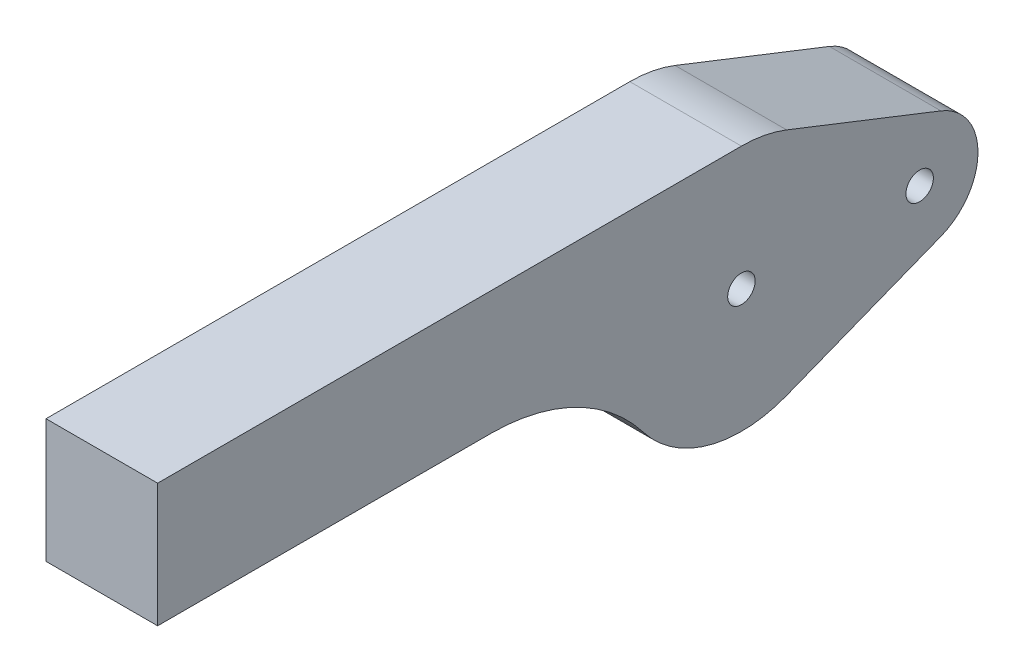
ISO-10303-21;
HEADER;
FILE_DESCRIPTION(('STEP AP214'),'2;1');
FILE_NAME('part.step','',(''),(''),'','','');
FILE_SCHEMA(('AUTOMOTIVE_DESIGN { 1 0 10303 214 1 1 1 1 }'));
ENDSEC;
DATA;
#1=APPLICATION_CONTEXT('core data for automotive mechanical design processes');
#2=APPLICATION_PROTOCOL_DEFINITION('international standard','automotive_design',2000,#1);
#3=PRODUCT_CONTEXT('',#1,'mechanical');
#4=PRODUCT('Part','Part','',(#3));
#5=PRODUCT_RELATED_PRODUCT_CATEGORY('part','',(#4));
#6=PRODUCT_DEFINITION_FORMATION('','',#4);
#7=PRODUCT_DEFINITION_CONTEXT('part definition',#1,'design');
#8=PRODUCT_DEFINITION('design','',#6,#7);
#9=PRODUCT_DEFINITION_SHAPE('','',#8);
#10=(LENGTH_UNIT() NAMED_UNIT(*) SI_UNIT(.MILLI.,.METRE.));
#11=(NAMED_UNIT(*) PLANE_ANGLE_UNIT() SI_UNIT($,.RADIAN.));
#12=(NAMED_UNIT(*) SI_UNIT($,.STERADIAN.) SOLID_ANGLE_UNIT());
#13=UNCERTAINTY_MEASURE_WITH_UNIT(LENGTH_MEASURE(1.E-05),#10,'distance_accuracy_value','');
#14=(GEOMETRIC_REPRESENTATION_CONTEXT(3) GLOBAL_UNCERTAINTY_ASSIGNED_CONTEXT((#13)) GLOBAL_UNIT_ASSIGNED_CONTEXT((#10,
#11,#12)) REPRESENTATION_CONTEXT('',''));
#15=CARTESIAN_POINT('',(0.,0.,0.));
#16=DIRECTION('',(0.,0.,1.));
#17=DIRECTION('',(1.,0.,0.));
#18=AXIS2_PLACEMENT_3D('',#15,#16,#17);
#19=CARTESIAN_POINT('',(8.13,-12.6395781143614,-4.97017753993936));
#20=DIRECTION('',(0.,-0.930635452518069,-0.365947611710323));
#21=DIRECTION('',(0.,0.365947611710323,-0.930635452518069));
#22=AXIS2_PLACEMENT_3D('',#19,#20,#21);
#23=PLANE('',#22);
#24=DIRECTION('',(0.,-0.365947611710323,0.930635452518069));
#25=VECTOR('',#24,1.);
#26=CARTESIAN_POINT('',(0.,-12.6395781143614,-4.97017753993936));
#27=LINE('',#26,#25);
#28=CARTESIAN_POINT('',(0.,-3.95520067320179,-27.0552773497689));
#29=VERTEX_POINT('',#28);
#30=CARTESIAN_POINT('',(0.,-8.37571907266262,-15.8135285053929));
#31=VERTEX_POINT('',#30);
#32=EDGE_CURVE('E125',#29,#31,#27,.T.);
#33=ORIENTED_EDGE('',*,*,#32,.F.);
#34=DIRECTION('',(-1.,0.,0.));
#35=VECTOR('',#34,1.);
#36=CARTESIAN_POINT('',(8.13,-3.95520067320179,-27.0552773497689));
#37=LINE('',#36,#35);
#38=CARTESIAN_POINT('',(8.13,-3.95520067320179,-27.0552773497689));
#39=VERTEX_POINT('',#38);
#40=EDGE_CURVE('E119',#39,#29,#37,.T.);
#41=ORIENTED_EDGE('',*,*,#40,.F.);
#42=DIRECTION('',(0.,-0.365947611710323,0.930635452518069));
#43=VECTOR('',#42,1.);
#44=CARTESIAN_POINT('',(8.13,-12.6395781143614,-4.97017753993936));
#45=LINE('',#44,#43);
#46=CARTESIAN_POINT('',(8.13,-8.37571907266262,-15.8135285053929));
#47=VERTEX_POINT('',#46);
#48=EDGE_CURVE('E123',#39,#47,#45,.T.);
#49=ORIENTED_EDGE('',*,*,#48,.T.);
#50=DIRECTION('',(-1.,0.,0.));
#51=VECTOR('',#50,1.);
#52=CARTESIAN_POINT('',(8.13,-8.37571907266262,-15.8135285053929));
#53=LINE('',#52,#51);
#54=EDGE_CURVE('E179',#47,#31,#53,.T.);
#55=ORIENTED_EDGE('',*,*,#54,.T.);
#56=EDGE_LOOP('',(#33,#41,#49,#55));
#57=FACE_BOUND('',#56,.T.);
#58=ADVANCED_FACE('F47',(#57),#23,.T.);
#59=CARTESIAN_POINT('',(8.13,0.,-25.5));
#60=DIRECTION('',(-1.,0.,0.));
#61=DIRECTION('',(0.,0.,1.));
#62=AXIS2_PLACEMENT_3D('',#59,#60,#61);
#63=CYLINDRICAL_SURFACE('',#62,4.25);
#64=CARTESIAN_POINT('',(0.,0.,-25.5));
#65=DIRECTION('',(1.,0.,0.));
#66=DIRECTION('',(0.,0.,-1.));
#67=AXIS2_PLACEMENT_3D('',#64,#65,#66);
#68=CIRCLE('',#67,4.25);
#69=CARTESIAN_POINT('',(0.,3.95520067320179,-27.0552773497689));
#70=VERTEX_POINT('',#69);
#71=EDGE_CURVE('E182',#29,#70,#68,.T.);
#72=ORIENTED_EDGE('',*,*,#71,.T.);
#73=DIRECTION('',(-1.,0.,0.));
#74=VECTOR('',#73,1.);
#75=CARTESIAN_POINT('',(8.13,3.95520067320179,-27.0552773497689));
#76=LINE('',#75,#74);
#77=CARTESIAN_POINT('',(8.13,3.95520067320179,-27.0552773497689));
#78=VERTEX_POINT('',#77);
#79=EDGE_CURVE('E130',#78,#70,#76,.T.);
#80=ORIENTED_EDGE('',*,*,#79,.F.);
#81=CARTESIAN_POINT('',(8.13,0.,-25.5));
#82=DIRECTION('',(1.,0.,0.));
#83=DIRECTION('',(0.,0.,-1.));
#84=AXIS2_PLACEMENT_3D('',#81,#82,#83);
#85=CIRCLE('',#84,4.25);
#86=EDGE_CURVE('E133',#39,#78,#85,.T.);
#87=ORIENTED_EDGE('',*,*,#86,.F.);
#88=ORIENTED_EDGE('',*,*,#40,.T.);
#89=EDGE_LOOP('',(#72,#80,#87,#88));
#90=FACE_BOUND('',#89,.T.);
#91=ADVANCED_FACE('F134',(#90),#63,.T.);
#92=CARTESIAN_POINT('',(8.13,12.6395781143614,-4.97017753993937));
#93=DIRECTION('',(0.,-0.930635452518069,0.365947611710324));
#94=DIRECTION('',(0.,-0.365947611710324,-0.930635452518069));
#95=AXIS2_PLACEMENT_3D('',#92,#93,#94);
#96=PLANE('',#95);
#97=DIRECTION('',(0.,0.365947611710324,0.930635452518069));
#98=VECTOR('',#97,1.);
#99=CARTESIAN_POINT('',(0.,12.6395781143614,-4.97017753993937));
#100=LINE('',#99,#98);
#101=CARTESIAN_POINT('',(0.,8.37571907266262,-15.8135285053929));
#102=VERTEX_POINT('',#101);
#103=EDGE_CURVE('E185',#70,#102,#100,.T.);
#104=ORIENTED_EDGE('',*,*,#103,.T.);
#105=DIRECTION('',(-1.,0.,0.));
#106=VECTOR('',#105,1.);
#107=CARTESIAN_POINT('',(8.13,8.37571907266262,-15.8135285053929));
#108=LINE('',#107,#106);
#109=CARTESIAN_POINT('',(8.13,8.37571907266262,-15.8135285053929));
#110=VERTEX_POINT('',#109);
#111=EDGE_CURVE('E220',#110,#102,#108,.T.);
#112=ORIENTED_EDGE('',*,*,#111,.F.);
#113=DIRECTION('',(0.,0.365947611710324,0.930635452518069));
#114=VECTOR('',#113,1.);
#115=CARTESIAN_POINT('',(8.13,12.6395781143614,-4.97017753993937));
#116=LINE('',#115,#114);
#117=EDGE_CURVE('E139',#78,#110,#116,.T.);
#118=ORIENTED_EDGE('',*,*,#117,.F.);
#119=ORIENTED_EDGE('',*,*,#79,.T.);
#120=EDGE_LOOP('',(#104,#112,#118,#119));
#121=FACE_BOUND('',#120,.T.);
#122=ADVANCED_FACE('F241',(#121),#96,.F.);
#123=CARTESIAN_POINT('',(8.13,0.,-12.52));
#124=DIRECTION('',(-1.,0.,0.));
#125=DIRECTION('',(0.,0.,1.));
#126=AXIS2_PLACEMENT_3D('',#123,#124,#125);
#127=CYLINDRICAL_SURFACE('',#126,9.);
#128=CARTESIAN_POINT('',(0.,0.,-12.52));
#129=DIRECTION('',(1.,0.,0.));
#130=DIRECTION('',(0.,0.,-1.));
#131=AXIS2_PLACEMENT_3D('',#128,#129,#130);
#132=CIRCLE('',#131,9.);
#133=CARTESIAN_POINT('',(0.,9.,-12.52));
#134=VERTEX_POINT('',#133);
#135=EDGE_CURVE('E188',#102,#134,#132,.T.);
#136=ORIENTED_EDGE('',*,*,#135,.T.);
#137=DIRECTION('',(-1.,0.,0.));
#138=VECTOR('',#137,1.);
#139=CARTESIAN_POINT('',(8.13,9.,-12.52));
#140=LINE('',#139,#138);
#141=CARTESIAN_POINT('',(8.13,9.,-12.52));
#142=VERTEX_POINT('',#141);
#143=EDGE_CURVE('E216',#142,#134,#140,.T.);
#144=ORIENTED_EDGE('',*,*,#143,.F.);
#145=CARTESIAN_POINT('',(8.13,0.,-12.52));
#146=DIRECTION('',(1.,0.,0.));
#147=DIRECTION('',(0.,0.,-1.));
#148=AXIS2_PLACEMENT_3D('',#145,#146,#147);
#149=CIRCLE('',#148,9.);
#150=EDGE_CURVE('E156',#110,#142,#149,.T.);
#151=ORIENTED_EDGE('',*,*,#150,.F.);
#152=ORIENTED_EDGE('',*,*,#111,.T.);
#153=EDGE_LOOP('',(#136,#144,#151,#152));
#154=FACE_BOUND('',#153,.T.);
#155=ADVANCED_FACE('F249',(#154),#127,.T.);
#156=CARTESIAN_POINT('',(8.13,9.,0.));
#157=DIRECTION('',(0.,-1.,0.));
#158=DIRECTION('',(0.,0.,-1.));
#159=AXIS2_PLACEMENT_3D('',#156,#157,#158);
#160=PLANE('',#159);
#161=DIRECTION('',(0.,0.,1.));
#162=VECTOR('',#161,1.);
#163=CARTESIAN_POINT('',(0.,9.,0.));
#164=LINE('',#163,#162);
#165=CARTESIAN_POINT('',(0.,9.,30.));
#166=VERTEX_POINT('',#165);
#167=EDGE_CURVE('E191',#134,#166,#164,.T.);
#168=ORIENTED_EDGE('',*,*,#167,.T.);
#169=DIRECTION('',(-1.,0.,0.));
#170=VECTOR('',#169,1.);
#171=CARTESIAN_POINT('',(8.13,9.,30.));
#172=LINE('',#171,#170);
#173=CARTESIAN_POINT('',(8.13,9.,30.));
#174=VERTEX_POINT('',#173);
#175=EDGE_CURVE('E213',#174,#166,#172,.T.);
#176=ORIENTED_EDGE('',*,*,#175,.F.);
#177=DIRECTION('',(0.,0.,1.));
#178=VECTOR('',#177,1.);
#179=CARTESIAN_POINT('',(8.13,9.,0.));
#180=LINE('',#179,#178);
#181=EDGE_CURVE('E159',#142,#174,#180,.T.);
#182=ORIENTED_EDGE('',*,*,#181,.F.);
#183=ORIENTED_EDGE('',*,*,#143,.T.);
#184=EDGE_LOOP('',(#168,#176,#182,#183));
#185=FACE_BOUND('',#184,.T.);
#186=ADVANCED_FACE('F252',(#185),#160,.F.);
#187=CARTESIAN_POINT('',(8.13,0.,30.));
#188=DIRECTION('',(0.,0.,1.));
#189=DIRECTION('',(1.,0.,0.));
#190=AXIS2_PLACEMENT_3D('',#187,#188,#189);
#191=PLANE('',#190);
#192=DIRECTION('',(0.,1.,0.));
#193=VECTOR('',#192,1.);
#194=CARTESIAN_POINT('',(0.,0.,30.));
#195=LINE('',#194,#193);
#196=CARTESIAN_POINT('',(0.,0.,30.));
#197=VERTEX_POINT('',#196);
#198=EDGE_CURVE('E195',#197,#166,#195,.T.);
#199=ORIENTED_EDGE('',*,*,#198,.F.);
#200=DIRECTION('',(-1.,0.,0.));
#201=VECTOR('',#200,1.);
#202=CARTESIAN_POINT('',(8.13,0.,30.));
#203=LINE('',#202,#201);
#204=CARTESIAN_POINT('',(8.13,0.,30.));
#205=VERTEX_POINT('',#204);
#206=EDGE_CURVE('E210',#205,#197,#203,.T.);
#207=ORIENTED_EDGE('',*,*,#206,.F.);
#208=DIRECTION('',(0.,1.,0.));
#209=VECTOR('',#208,1.);
#210=CARTESIAN_POINT('',(8.13,0.,30.));
#211=LINE('',#210,#209);
#212=EDGE_CURVE('E162',#205,#174,#211,.T.);
#213=ORIENTED_EDGE('',*,*,#212,.T.);
#214=ORIENTED_EDGE('',*,*,#175,.T.);
#215=EDGE_LOOP('',(#199,#207,#213,#214));
#216=FACE_BOUND('',#215,.T.);
#217=ADVANCED_FACE('F255',(#216),#191,.T.);
#218=CARTESIAN_POINT('',(8.13,0.,0.));
#219=DIRECTION('',(0.,1.,0.));
#220=DIRECTION('',(0.,0.,1.));
#221=AXIS2_PLACEMENT_3D('',#218,#219,#220);
#222=PLANE('',#221);
#223=DIRECTION('',(0.,0.,-1.));
#224=VECTOR('',#223,1.);
#225=CARTESIAN_POINT('',(0.,0.,0.));
#226=LINE('',#225,#224);
#227=CARTESIAN_POINT('',(0.,0.,5.72828759089464));
#228=VERTEX_POINT('',#227);
#229=EDGE_CURVE('E199',#197,#228,#226,.T.);
#230=ORIENTED_EDGE('',*,*,#229,.T.);
#231=DIRECTION('',(1.,0.,0.));
#232=VECTOR('',#231,1.);
#233=CARTESIAN_POINT('',(8.13,0.,5.72828759089464));
#234=LINE('',#233,#232);
#235=CARTESIAN_POINT('',(8.13,0.,5.72828759089464));
#236=VERTEX_POINT('',#235);
#237=EDGE_CURVE('E63',#228,#236,#234,.T.);
#238=ORIENTED_EDGE('',*,*,#237,.T.);
#239=DIRECTION('',(0.,0.,-1.));
#240=VECTOR('',#239,1.);
#241=CARTESIAN_POINT('',(8.13,0.,0.));
#242=LINE('',#241,#240);
#243=EDGE_CURVE('E166',#205,#236,#242,.T.);
#244=ORIENTED_EDGE('',*,*,#243,.F.);
#245=ORIENTED_EDGE('',*,*,#206,.T.);
#246=EDGE_LOOP('',(#230,#238,#244,#245));
#247=FACE_BOUND('',#246,.T.);
#248=ADVANCED_FACE('F275',(#247),#222,.F.);
#249=CARTESIAN_POINT('',(8.13,0.,-25.5));
#250=DIRECTION('',(-1.,0.,0.));
#251=DIRECTION('',(0.,0.,1.));
#252=AXIS2_PLACEMENT_3D('',#249,#250,#251);
#253=CYLINDRICAL_SURFACE('',#252,1.);
#254=CARTESIAN_POINT('',(8.13,0.,-25.5));
#255=DIRECTION('',(1.,0.,0.));
#256=DIRECTION('',(0.,0.,-1.));
#257=AXIS2_PLACEMENT_3D('',#254,#255,#256);
#258=CIRCLE('',#257,1.);
#259=CARTESIAN_POINT('',(8.13,0.,-26.5));
#260=VERTEX_POINT('',#259);
#261=EDGE_CURVE('E171',#260,#260,#258,.T.);
#262=ORIENTED_EDGE('',*,*,#261,.T.);
#263=EDGE_LOOP('',(#262));
#264=FACE_BOUND('',#263,.T.);
#265=CARTESIAN_POINT('',(0.,0.,-25.5));
#266=DIRECTION('',(1.,0.,0.));
#267=DIRECTION('',(0.,0.,-1.));
#268=AXIS2_PLACEMENT_3D('',#265,#266,#267);
#269=CIRCLE('',#268,1.);
#270=CARTESIAN_POINT('',(0.,0.,-26.5));
#271=VERTEX_POINT('',#270);
#272=EDGE_CURVE('E151',#271,#271,#269,.T.);
#273=ORIENTED_EDGE('',*,*,#272,.F.);
#274=EDGE_LOOP('',(#273));
#275=FACE_BOUND('',#274,.T.);
#276=ADVANCED_FACE('F278',(#264,#275),#253,.F.);
#277=CARTESIAN_POINT('',(8.13,0.,-12.52));
#278=DIRECTION('',(-1.,0.,0.));
#279=DIRECTION('',(0.,0.,1.));
#280=AXIS2_PLACEMENT_3D('',#277,#278,#279);
#281=CYLINDRICAL_SURFACE('',#280,9.);
#282=CARTESIAN_POINT('',(8.13,0.,-12.52));
#283=DIRECTION('',(1.,0.,0.));
#284=DIRECTION('',(0.,0.,-1.));
#285=AXIS2_PLACEMENT_3D('',#282,#283,#284);
#286=CIRCLE('',#285,9.);
#287=CARTESIAN_POINT('',(8.13,-5.47826086956522,-5.3793657253021));
#288=VERTEX_POINT('',#287);
#289=EDGE_CURVE('E144',#288,#47,#286,.T.);
#290=ORIENTED_EDGE('',*,*,#289,.F.);
#291=DIRECTION('',(-1.,0.,0.));
#292=VECTOR('',#291,1.);
#293=CARTESIAN_POINT('',(8.13,-5.47826086956522,-5.3793657253021));
#294=LINE('',#293,#292);
#295=CARTESIAN_POINT('',(0.,-5.47826086956522,-5.3793657253021));
#296=VERTEX_POINT('',#295);
#297=EDGE_CURVE('E129',#288,#296,#294,.T.);
#298=ORIENTED_EDGE('',*,*,#297,.T.);
#299=CARTESIAN_POINT('',(0.,0.,-12.52));
#300=DIRECTION('',(1.,0.,0.));
#301=DIRECTION('',(0.,0.,-1.));
#302=AXIS2_PLACEMENT_3D('',#299,#300,#301);
#303=CIRCLE('',#302,9.);
#304=EDGE_CURVE('E202',#296,#31,#303,.T.);
#305=ORIENTED_EDGE('',*,*,#304,.T.);
#306=ORIENTED_EDGE('',*,*,#54,.F.);
#307=EDGE_LOOP('',(#290,#298,#305,#306));
#308=FACE_BOUND('',#307,.T.);
#309=ADVANCED_FACE('F233',(#308),#281,.T.);
#310=CARTESIAN_POINT('',(8.13,0.,-12.52));
#311=DIRECTION('',(-1.,0.,0.));
#312=DIRECTION('',(0.,0.,1.));
#313=AXIS2_PLACEMENT_3D('',#310,#311,#312);
#314=CYLINDRICAL_SURFACE('',#313,1.);
#315=CARTESIAN_POINT('',(8.13,0.,-12.52));
#316=DIRECTION('',(1.,0.,0.));
#317=DIRECTION('',(0.,0.,-1.));
#318=AXIS2_PLACEMENT_3D('',#315,#316,#317);
#319=CIRCLE('',#318,1.);
#320=CARTESIAN_POINT('',(8.13,0.,-13.52));
#321=VERTEX_POINT('',#320);
#322=EDGE_CURVE('E175',#321,#321,#319,.T.);
#323=ORIENTED_EDGE('',*,*,#322,.T.);
#324=EDGE_LOOP('',(#323));
#325=FACE_BOUND('',#324,.T.);
#326=CARTESIAN_POINT('',(0.,0.,-12.52));
#327=DIRECTION('',(1.,0.,0.));
#328=DIRECTION('',(0.,0.,-1.));
#329=AXIS2_PLACEMENT_3D('',#326,#327,#328);
#330=CIRCLE('',#329,1.);
#331=CARTESIAN_POINT('',(0.,0.,-13.52));
#332=VERTEX_POINT('',#331);
#333=EDGE_CURVE('E147',#332,#332,#330,.T.);
#334=ORIENTED_EDGE('',*,*,#333,.F.);
#335=EDGE_LOOP('',(#334));
#336=FACE_BOUND('',#335,.T.);
#337=ADVANCED_FACE('F281',(#325,#336),#314,.F.);
#338=CARTESIAN_POINT('',(8.13,0.,0.));
#339=DIRECTION('',(1.,0.,0.));
#340=DIRECTION('',(0.,0.,-1.));
#341=AXIS2_PLACEMENT_3D('',#338,#339,#340);
#342=PLANE('',#341);
#343=ORIENTED_EDGE('',*,*,#48,.F.);
#344=ORIENTED_EDGE('',*,*,#86,.T.);
#345=ORIENTED_EDGE('',*,*,#117,.T.);
#346=ORIENTED_EDGE('',*,*,#150,.T.);
#347=ORIENTED_EDGE('',*,*,#181,.T.);
#348=ORIENTED_EDGE('',*,*,#212,.F.);
#349=ORIENTED_EDGE('',*,*,#243,.T.);
#350=CARTESIAN_POINT('',(8.13,-14.,5.72828759089464));
#351=DIRECTION('',(1.,0.,0.));
#352=DIRECTION('',(0.,0.,-1.));
#353=AXIS2_PLACEMENT_3D('',#350,#351,#352);
#354=CIRCLE('',#353,14.);
#355=EDGE_CURVE('E11',#236,#288,#354,.F.);
#356=ORIENTED_EDGE('',*,*,#355,.T.);
#357=ORIENTED_EDGE('',*,*,#289,.T.);
#358=EDGE_LOOP('',(#343,#344,#345,#346,#347,#348,#349,#356,#357));
#359=FACE_BOUND('',#358,.T.);
#360=ORIENTED_EDGE('',*,*,#261,.F.);
#361=EDGE_LOOP('',(#360));
#362=FACE_BOUND('',#361,.T.);
#363=ORIENTED_EDGE('',*,*,#322,.F.);
#364=EDGE_LOOP('',(#363));
#365=FACE_BOUND('',#364,.T.);
#366=ADVANCED_FACE('F141',(#359,#362,#365),#342,.T.);
#367=CARTESIAN_POINT('',(0.,0.,0.));
#368=DIRECTION('',(1.,0.,0.));
#369=DIRECTION('',(0.,0.,-1.));
#370=AXIS2_PLACEMENT_3D('',#367,#368,#369);
#371=PLANE('',#370);
#372=ORIENTED_EDGE('',*,*,#32,.T.);
#373=ORIENTED_EDGE('',*,*,#304,.F.);
#374=CARTESIAN_POINT('',(0.,-14.,5.72828759089464));
#375=DIRECTION('',(1.,0.,0.));
#376=DIRECTION('',(0.,0.,-1.));
#377=AXIS2_PLACEMENT_3D('',#374,#375,#376);
#378=CIRCLE('',#377,14.);
#379=EDGE_CURVE('E56',#296,#228,#378,.T.);
#380=ORIENTED_EDGE('',*,*,#379,.T.);
#381=ORIENTED_EDGE('',*,*,#229,.F.);
#382=ORIENTED_EDGE('',*,*,#198,.T.);
#383=ORIENTED_EDGE('',*,*,#167,.F.);
#384=ORIENTED_EDGE('',*,*,#135,.F.);
#385=ORIENTED_EDGE('',*,*,#103,.F.);
#386=ORIENTED_EDGE('',*,*,#71,.F.);
#387=EDGE_LOOP('',(#372,#373,#380,#381,#382,#383,#384,#385,#386));
#388=FACE_BOUND('',#387,.T.);
#389=ORIENTED_EDGE('',*,*,#272,.T.);
#390=EDGE_LOOP('',(#389));
#391=FACE_BOUND('',#390,.T.);
#392=ORIENTED_EDGE('',*,*,#333,.T.);
#393=EDGE_LOOP('',(#392));
#394=FACE_BOUND('',#393,.T.);
#395=ADVANCED_FACE('F236',(#388,#391,#394),#371,.F.);
#396=CARTESIAN_POINT('',(8.13,-14.,5.72828759089464));
#397=DIRECTION('',(-1.,0.,0.));
#398=DIRECTION('',(0.,0.,1.));
#399=AXIS2_PLACEMENT_3D('',#396,#397,#398);
#400=CYLINDRICAL_SURFACE('',#399,14.);
#401=ORIENTED_EDGE('',*,*,#355,.F.);
#402=ORIENTED_EDGE('',*,*,#237,.F.);
#403=ORIENTED_EDGE('',*,*,#379,.F.);
#404=ORIENTED_EDGE('',*,*,#297,.F.);
#405=EDGE_LOOP('',(#401,#402,#403,#404));
#406=FACE_BOUND('',#405,.T.);
#407=ADVANCED_FACE('F49',(#406),#400,.F.);
#408=CLOSED_SHELL('',(#58,#91,#122,#155,#186,#217,#248,#276,#309,#337,#366,#395,#407));
#409=MANIFOLD_SOLID_BREP('B2',#408);
#410=ADVANCED_BREP_SHAPE_REPRESENTATION('',(#18,#409),#14);
#411=SHAPE_DEFINITION_REPRESENTATION(#9,#410);
ENDSEC;
END-ISO-10303-21;
